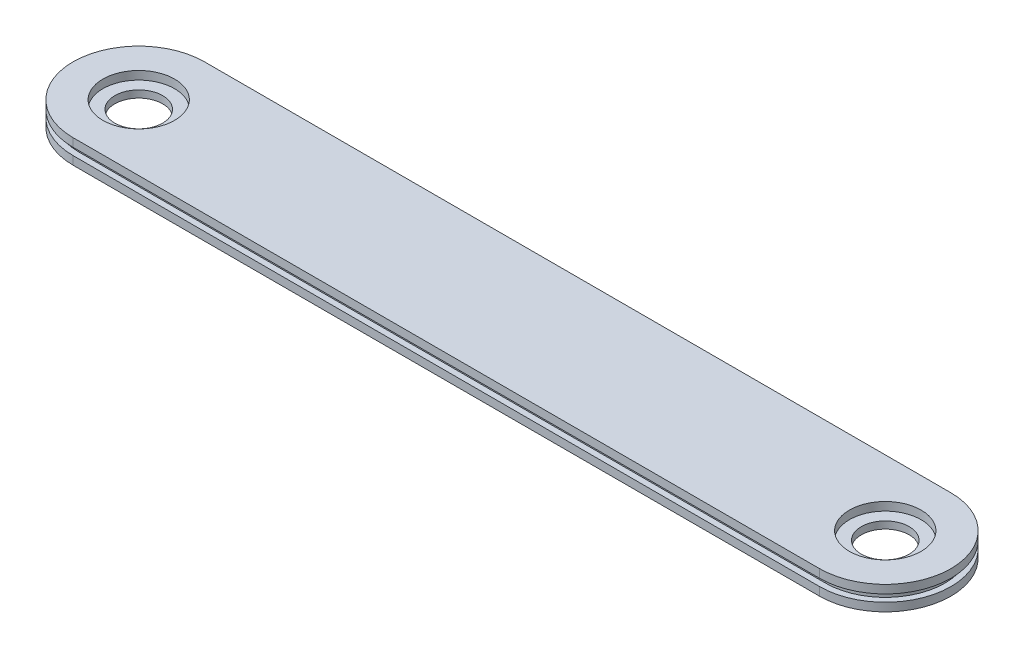
ISO-10303-21;
HEADER;
FILE_DESCRIPTION(('STEP AP214'),'2;1');
FILE_NAME('part.step','',(''),(''),'','','');
FILE_SCHEMA(('AUTOMOTIVE_DESIGN { 1 0 10303 214 1 1 1 1 }'));
ENDSEC;
DATA;
#1=APPLICATION_CONTEXT('core data for automotive mechanical design processes');
#2=APPLICATION_PROTOCOL_DEFINITION('international standard','automotive_design',2000,#1);
#3=PRODUCT_CONTEXT('',#1,'mechanical');
#4=PRODUCT('Part','Part','',(#3));
#5=PRODUCT_RELATED_PRODUCT_CATEGORY('part','',(#4));
#6=PRODUCT_DEFINITION_FORMATION('','',#4);
#7=PRODUCT_DEFINITION_CONTEXT('part definition',#1,'design');
#8=PRODUCT_DEFINITION('design','',#6,#7);
#9=PRODUCT_DEFINITION_SHAPE('','',#8);
#10=(LENGTH_UNIT() NAMED_UNIT(*) SI_UNIT(.MILLI.,.METRE.));
#11=(NAMED_UNIT(*) PLANE_ANGLE_UNIT() SI_UNIT($,.RADIAN.));
#12=(NAMED_UNIT(*) SI_UNIT($,.STERADIAN.) SOLID_ANGLE_UNIT());
#13=UNCERTAINTY_MEASURE_WITH_UNIT(LENGTH_MEASURE(1.E-05),#10,'distance_accuracy_value','');
#14=(GEOMETRIC_REPRESENTATION_CONTEXT(3) GLOBAL_UNCERTAINTY_ASSIGNED_CONTEXT((#13)) GLOBAL_UNIT_ASSIGNED_CONTEXT((#10,
#11,#12)) REPRESENTATION_CONTEXT('',''));
#15=CARTESIAN_POINT('',(0.,0.,0.));
#16=DIRECTION('',(0.,0.,1.));
#17=DIRECTION('',(1.,0.,0.));
#18=AXIS2_PLACEMENT_3D('',#15,#16,#17);
#19=CARTESIAN_POINT('',(0.,-3.,0.));
#20=DIRECTION('',(0.,1.,0.));
#21=DIRECTION('',(0.,0.,1.));
#22=AXIS2_PLACEMENT_3D('',#19,#20,#21);
#23=CYLINDRICAL_SURFACE('',#22,30.);
#24=CARTESIAN_POINT('',(0.,-10.,0.));
#25=DIRECTION('',(0.,1.,0.));
#26=DIRECTION('',(0.,0.,1.));
#27=AXIS2_PLACEMENT_3D('',#24,#25,#26);
#28=CIRCLE('',#27,30.);
#29=CARTESIAN_POINT('',(0.,-10.,30.));
#30=VERTEX_POINT('',#29);
#31=EDGE_CURVE('E451',#30,#30,#28,.T.);
#32=ORIENTED_EDGE('',*,*,#31,.F.);
#33=EDGE_LOOP('',(#32));
#34=FACE_BOUND('',#33,.T.);
#35=CARTESIAN_POINT('',(0.,-3.,0.));
#36=DIRECTION('',(0.,1.,0.));
#37=DIRECTION('',(0.,0.,1.));
#38=AXIS2_PLACEMENT_3D('',#35,#36,#37);
#39=CIRCLE('',#38,30.);
#40=CARTESIAN_POINT('',(0.,-3.,30.));
#41=VERTEX_POINT('',#40);
#42=EDGE_CURVE('E13',#41,#41,#39,.F.);
#43=ORIENTED_EDGE('',*,*,#42,.F.);
#44=EDGE_LOOP('',(#43));
#45=FACE_BOUND('',#44,.T.);
#46=ADVANCED_FACE('F193',(#34,#45),#23,.F.);
#47=CARTESIAN_POINT('',(625.,-3.,0.));
#48=DIRECTION('',(0.,1.,0.));
#49=DIRECTION('',(0.,0.,1.));
#50=AXIS2_PLACEMENT_3D('',#47,#48,#49);
#51=CYLINDRICAL_SURFACE('',#50,29.9999999999999);
#52=CARTESIAN_POINT('',(625.,-10.,0.));
#53=DIRECTION('',(0.,-1.,0.));
#54=DIRECTION('',(0.,0.,-1.));
#55=AXIS2_PLACEMENT_3D('',#52,#53,#54);
#56=CIRCLE('',#55,29.9999999999999);
#57=CARTESIAN_POINT('',(625.,-10.,-29.9999999999999));
#58=VERTEX_POINT('',#57);
#59=EDGE_CURVE('E383',#58,#58,#56,.T.);
#60=ORIENTED_EDGE('',*,*,#59,.T.);
#61=EDGE_LOOP('',(#60));
#62=FACE_BOUND('',#61,.T.);
#63=CARTESIAN_POINT('',(625.,-3.,0.));
#64=DIRECTION('',(0.,1.,0.));
#65=DIRECTION('',(0.,0.,1.));
#66=AXIS2_PLACEMENT_3D('',#63,#64,#65);
#67=CIRCLE('',#66,29.9999999999999);
#68=CARTESIAN_POINT('',(625.,-3.,29.9999999999999));
#69=VERTEX_POINT('',#68);
#70=EDGE_CURVE('E454',#69,#69,#67,.F.);
#71=ORIENTED_EDGE('',*,*,#70,.F.);
#72=EDGE_LOOP('',(#71));
#73=FACE_BOUND('',#72,.T.);
#74=ADVANCED_FACE('F378',(#62,#73),#51,.F.);
#75=CARTESIAN_POINT('',(0.,10.,0.));
#76=DIRECTION('',(0.,-1.,0.));
#77=DIRECTION('',(0.,0.,-1.));
#78=AXIS2_PLACEMENT_3D('',#75,#76,#77);
#79=CYLINDRICAL_SURFACE('',#78,55.);
#80=CARTESIAN_POINT('',(0.,-3.,0.));
#81=DIRECTION('',(0.,1.,0.));
#82=DIRECTION('',(0.,0.,1.));
#83=AXIS2_PLACEMENT_3D('',#80,#81,#82);
#84=CIRCLE('',#83,55.);
#85=CARTESIAN_POINT('',(0.,-3.,-55.));
#86=VERTEX_POINT('',#85);
#87=CARTESIAN_POINT('',(0.,-3.,55.));
#88=VERTEX_POINT('',#87);
#89=EDGE_CURVE('E324',#86,#88,#84,.T.);
#90=ORIENTED_EDGE('',*,*,#89,.F.);
#91=DIRECTION('',(0.,-1.,0.));
#92=VECTOR('',#91,1.);
#93=CARTESIAN_POINT('',(0.,10.,-55.));
#94=LINE('',#93,#92);
#95=CARTESIAN_POINT('',(0.,-10.,-55.));
#96=VERTEX_POINT('',#95);
#97=EDGE_CURVE('E338',#86,#96,#94,.T.);
#98=ORIENTED_EDGE('',*,*,#97,.T.);
#99=CARTESIAN_POINT('',(0.,-10.,0.));
#100=DIRECTION('',(0.,1.,0.));
#101=DIRECTION('',(0.,0.,1.));
#102=AXIS2_PLACEMENT_3D('',#99,#100,#101);
#103=CIRCLE('',#102,55.);
#104=CARTESIAN_POINT('',(0.,-10.,55.));
#105=VERTEX_POINT('',#104);
#106=EDGE_CURVE('E326',#96,#105,#103,.T.);
#107=ORIENTED_EDGE('',*,*,#106,.T.);
#108=DIRECTION('',(0.,-1.,0.));
#109=VECTOR('',#108,1.);
#110=CARTESIAN_POINT('',(0.,10.,55.));
#111=LINE('',#110,#109);
#112=EDGE_CURVE('E360',#88,#105,#111,.T.);
#113=ORIENTED_EDGE('',*,*,#112,.F.);
#114=EDGE_LOOP('',(#90,#98,#107,#113));
#115=FACE_BOUND('',#114,.T.);
#116=ADVANCED_FACE('F425',(#115),#79,.T.);
#117=CARTESIAN_POINT('',(0.,10.,55.));
#118=DIRECTION('',(0.,0.,-1.));
#119=DIRECTION('',(-1.,0.,0.));
#120=AXIS2_PLACEMENT_3D('',#117,#118,#119);
#121=PLANE('',#120);
#122=DIRECTION('',(1.,0.,0.));
#123=VECTOR('',#122,1.);
#124=CARTESIAN_POINT('',(0.,-3.,55.));
#125=LINE('',#124,#123);
#126=CARTESIAN_POINT('',(625.,-3.,55.));
#127=VERTEX_POINT('',#126);
#128=EDGE_CURVE('E322',#88,#127,#125,.T.);
#129=ORIENTED_EDGE('',*,*,#128,.F.);
#130=ORIENTED_EDGE('',*,*,#112,.T.);
#131=DIRECTION('',(1.,0.,0.));
#132=VECTOR('',#131,1.);
#133=CARTESIAN_POINT('',(0.,-10.,55.));
#134=LINE('',#133,#132);
#135=CARTESIAN_POINT('',(625.,-10.,55.));
#136=VERTEX_POINT('',#135);
#137=EDGE_CURVE('E341',#105,#136,#134,.T.);
#138=ORIENTED_EDGE('',*,*,#137,.T.);
#139=DIRECTION('',(0.,-1.,0.));
#140=VECTOR('',#139,1.);
#141=CARTESIAN_POINT('',(625.,10.,55.));
#142=LINE('',#141,#140);
#143=EDGE_CURVE('E356',#127,#136,#142,.T.);
#144=ORIENTED_EDGE('',*,*,#143,.F.);
#145=EDGE_LOOP('',(#129,#130,#138,#144));
#146=FACE_BOUND('',#145,.T.);
#147=ADVANCED_FACE('F502',(#146),#121,.F.);
#148=CARTESIAN_POINT('',(625.,10.,0.));
#149=DIRECTION('',(0.,-1.,0.));
#150=DIRECTION('',(0.,0.,-1.));
#151=AXIS2_PLACEMENT_3D('',#148,#149,#150);
#152=CYLINDRICAL_SURFACE('',#151,55.);
#153=CARTESIAN_POINT('',(625.,-3.,0.));
#154=DIRECTION('',(0.,1.,0.));
#155=DIRECTION('',(0.,0.,1.));
#156=AXIS2_PLACEMENT_3D('',#153,#154,#155);
#157=CIRCLE('',#156,55.);
#158=CARTESIAN_POINT('',(625.,-3.,-55.));
#159=VERTEX_POINT('',#158);
#160=EDGE_CURVE('E208',#127,#159,#157,.T.);
#161=ORIENTED_EDGE('',*,*,#160,.F.);
#162=ORIENTED_EDGE('',*,*,#143,.T.);
#163=CARTESIAN_POINT('',(625.,-10.,0.));
#164=DIRECTION('',(0.,1.,0.));
#165=DIRECTION('',(0.,0.,1.));
#166=AXIS2_PLACEMENT_3D('',#163,#164,#165);
#167=CIRCLE('',#166,55.);
#168=CARTESIAN_POINT('',(625.,-10.,-55.));
#169=VERTEX_POINT('',#168);
#170=EDGE_CURVE('E344',#136,#169,#167,.T.);
#171=ORIENTED_EDGE('',*,*,#170,.T.);
#172=DIRECTION('',(0.,-1.,0.));
#173=VECTOR('',#172,1.);
#174=CARTESIAN_POINT('',(625.,10.,-55.));
#175=LINE('',#174,#173);
#176=EDGE_CURVE('E352',#159,#169,#175,.T.);
#177=ORIENTED_EDGE('',*,*,#176,.F.);
#178=EDGE_LOOP('',(#161,#162,#171,#177));
#179=FACE_BOUND('',#178,.T.);
#180=ADVANCED_FACE('F499',(#179),#152,.T.);
#181=CARTESIAN_POINT('',(0.,10.,-55.));
#182=DIRECTION('',(0.,0.,-1.));
#183=DIRECTION('',(-1.,0.,0.));
#184=AXIS2_PLACEMENT_3D('',#181,#182,#183);
#185=PLANE('',#184);
#186=ORIENTED_EDGE('',*,*,#97,.F.);
#187=DIRECTION('',(1.,0.,0.));
#188=VECTOR('',#187,1.);
#189=CARTESIAN_POINT('',(0.,-3.,-55.));
#190=LINE('',#189,#188);
#191=EDGE_CURVE('E366',#86,#159,#190,.T.);
#192=ORIENTED_EDGE('',*,*,#191,.T.);
#193=ORIENTED_EDGE('',*,*,#176,.T.);
#194=DIRECTION('',(1.,0.,0.));
#195=VECTOR('',#194,1.);
#196=CARTESIAN_POINT('',(0.,-10.,-55.));
#197=LINE('',#196,#195);
#198=EDGE_CURVE('E331',#96,#169,#197,.T.);
#199=ORIENTED_EDGE('',*,*,#198,.F.);
#200=EDGE_LOOP('',(#186,#192,#193,#199));
#201=FACE_BOUND('',#200,.T.);
#202=ADVANCED_FACE('F491',(#201),#185,.T.);
#203=CARTESIAN_POINT('',(0.,-10.,0.));
#204=DIRECTION('',(0.,1.,0.));
#205=DIRECTION('',(0.,0.,1.));
#206=AXIS2_PLACEMENT_3D('',#203,#204,#205);
#207=PLANE('',#206);
#208=ORIENTED_EDGE('',*,*,#31,.T.);
#209=EDGE_LOOP('',(#208));
#210=FACE_BOUND('',#209,.T.);
#211=ORIENTED_EDGE('',*,*,#59,.F.);
#212=EDGE_LOOP('',(#211));
#213=FACE_BOUND('',#212,.T.);
#214=ORIENTED_EDGE('',*,*,#106,.F.);
#215=ORIENTED_EDGE('',*,*,#198,.T.);
#216=ORIENTED_EDGE('',*,*,#170,.F.);
#217=ORIENTED_EDGE('',*,*,#137,.F.);
#218=EDGE_LOOP('',(#214,#215,#216,#217));
#219=FACE_BOUND('',#218,.T.);
#220=ADVANCED_FACE('F477',(#210,#213,#219),#207,.F.);
#221=CARTESIAN_POINT('',(312.5,-3.,-32.1074938298136));
#222=DIRECTION('',(0.,1.,0.));
#223=DIRECTION('',(0.,0.,1.));
#224=AXIS2_PLACEMENT_3D('',#221,#222,#223);
#225=PLANE('',#224);
#226=DIRECTION('',(1.,0.,0.));
#227=VECTOR('',#226,1.);
#228=CARTESIAN_POINT('',(0.,-3.,-50.));
#229=LINE('',#228,#227);
#230=CARTESIAN_POINT('',(0.,-3.,-50.));
#231=VERTEX_POINT('',#230);
#232=CARTESIAN_POINT('',(625.,-3.,-50.));
#233=VERTEX_POINT('',#232);
#234=EDGE_CURVE('E290',#231,#233,#229,.T.);
#235=ORIENTED_EDGE('',*,*,#234,.T.);
#236=CARTESIAN_POINT('',(625.,-3.,0.));
#237=DIRECTION('',(0.,1.,0.));
#238=DIRECTION('',(0.,0.,1.));
#239=AXIS2_PLACEMENT_3D('',#236,#237,#238);
#240=CIRCLE('',#239,50.);
#241=CARTESIAN_POINT('',(625.,-3.,50.));
#242=VERTEX_POINT('',#241);
#243=EDGE_CURVE('E282',#242,#233,#240,.T.);
#244=ORIENTED_EDGE('',*,*,#243,.F.);
#245=DIRECTION('',(1.,0.,0.));
#246=VECTOR('',#245,1.);
#247=CARTESIAN_POINT('',(0.,-3.,50.));
#248=LINE('',#247,#246);
#249=CARTESIAN_POINT('',(0.,-3.,50.));
#250=VERTEX_POINT('',#249);
#251=EDGE_CURVE('E287',#250,#242,#248,.T.);
#252=ORIENTED_EDGE('',*,*,#251,.F.);
#253=CARTESIAN_POINT('',(0.,-3.,0.));
#254=DIRECTION('',(0.,1.,0.));
#255=DIRECTION('',(0.,0.,1.));
#256=AXIS2_PLACEMENT_3D('',#253,#254,#255);
#257=CIRCLE('',#256,50.);
#258=EDGE_CURVE('E307',#231,#250,#257,.T.);
#259=ORIENTED_EDGE('',*,*,#258,.F.);
#260=EDGE_LOOP('',(#235,#244,#252,#259));
#261=FACE_BOUND('',#260,.T.);
#262=ORIENTED_EDGE('',*,*,#89,.T.);
#263=ORIENTED_EDGE('',*,*,#128,.T.);
#264=ORIENTED_EDGE('',*,*,#160,.T.);
#265=ORIENTED_EDGE('',*,*,#191,.F.);
#266=EDGE_LOOP('',(#262,#263,#264,#265));
#267=FACE_BOUND('',#266,.T.);
#268=ADVANCED_FACE('F284',(#261,#267),#225,.T.);
#269=CARTESIAN_POINT('',(312.5,3.,-32.1074938298136));
#270=DIRECTION('',(0.,1.,0.));
#271=DIRECTION('',(0.,0.,1.));
#272=AXIS2_PLACEMENT_3D('',#269,#270,#271);
#273=PLANE('',#272);
#274=CARTESIAN_POINT('',(0.,3.,0.));
#275=DIRECTION('',(0.,1.,0.));
#276=DIRECTION('',(0.,0.,1.));
#277=AXIS2_PLACEMENT_3D('',#274,#275,#276);
#278=CIRCLE('',#277,50.);
#279=CARTESIAN_POINT('',(0.,3.,-50.));
#280=VERTEX_POINT('',#279);
#281=CARTESIAN_POINT('',(0.,3.,50.));
#282=VERTEX_POINT('',#281);
#283=EDGE_CURVE('E317',#280,#282,#278,.T.);
#284=ORIENTED_EDGE('',*,*,#283,.T.);
#285=DIRECTION('',(1.,0.,0.));
#286=VECTOR('',#285,1.);
#287=CARTESIAN_POINT('',(0.,3.,50.));
#288=LINE('',#287,#286);
#289=CARTESIAN_POINT('',(625.,3.,50.));
#290=VERTEX_POINT('',#289);
#291=EDGE_CURVE('E400',#282,#290,#288,.T.);
#292=ORIENTED_EDGE('',*,*,#291,.T.);
#293=CARTESIAN_POINT('',(625.,3.,0.));
#294=DIRECTION('',(0.,1.,0.));
#295=DIRECTION('',(0.,0.,1.));
#296=AXIS2_PLACEMENT_3D('',#293,#294,#295);
#297=CIRCLE('',#296,50.);
#298=CARTESIAN_POINT('',(625.,3.,-50.));
#299=VERTEX_POINT('',#298);
#300=EDGE_CURVE('E298',#290,#299,#297,.T.);
#301=ORIENTED_EDGE('',*,*,#300,.T.);
#302=DIRECTION('',(1.,0.,0.));
#303=VECTOR('',#302,1.);
#304=CARTESIAN_POINT('',(0.,3.,-50.));
#305=LINE('',#304,#303);
#306=EDGE_CURVE('E309',#280,#299,#305,.T.);
#307=ORIENTED_EDGE('',*,*,#306,.F.);
#308=EDGE_LOOP('',(#284,#292,#301,#307));
#309=FACE_BOUND('',#308,.T.);
#310=DIRECTION('',(1.,0.,0.));
#311=VECTOR('',#310,1.);
#312=CARTESIAN_POINT('',(0.,3.,-55.));
#313=LINE('',#312,#311);
#314=CARTESIAN_POINT('',(0.,3.,-55.));
#315=VERTEX_POINT('',#314);
#316=CARTESIAN_POINT('',(625.,3.,-55.));
#317=VERTEX_POINT('',#316);
#318=EDGE_CURVE('E364',#315,#317,#313,.T.);
#319=ORIENTED_EDGE('',*,*,#318,.T.);
#320=CARTESIAN_POINT('',(625.,3.,0.));
#321=DIRECTION('',(0.,1.,0.));
#322=DIRECTION('',(0.,0.,1.));
#323=AXIS2_PLACEMENT_3D('',#320,#321,#322);
#324=CIRCLE('',#323,55.);
#325=CARTESIAN_POINT('',(625.,3.,55.));
#326=VERTEX_POINT('',#325);
#327=EDGE_CURVE('E313',#326,#317,#324,.T.);
#328=ORIENTED_EDGE('',*,*,#327,.F.);
#329=DIRECTION('',(1.,0.,0.));
#330=VECTOR('',#329,1.);
#331=CARTESIAN_POINT('',(0.,3.,55.));
#332=LINE('',#331,#330);
#333=CARTESIAN_POINT('',(0.,3.,55.));
#334=VERTEX_POINT('',#333);
#335=EDGE_CURVE('E316',#334,#326,#332,.T.);
#336=ORIENTED_EDGE('',*,*,#335,.F.);
#337=CARTESIAN_POINT('',(0.,3.,0.));
#338=DIRECTION('',(0.,1.,0.));
#339=DIRECTION('',(0.,0.,1.));
#340=AXIS2_PLACEMENT_3D('',#337,#338,#339);
#341=CIRCLE('',#340,55.);
#342=EDGE_CURVE('E216',#315,#334,#341,.T.);
#343=ORIENTED_EDGE('',*,*,#342,.F.);
#344=EDGE_LOOP('',(#319,#328,#336,#343));
#345=FACE_BOUND('',#344,.T.);
#346=ADVANCED_FACE('F405',(#309,#345),#273,.F.);
#347=CARTESIAN_POINT('',(0.,-3.,0.));
#348=DIRECTION('',(0.,1.,0.));
#349=DIRECTION('',(0.,0.,1.));
#350=AXIS2_PLACEMENT_3D('',#347,#348,#349);
#351=CYLINDRICAL_SURFACE('',#350,50.);
#352=ORIENTED_EDGE('',*,*,#283,.F.);
#353=DIRECTION('',(0.,1.,0.));
#354=VECTOR('',#353,1.);
#355=CARTESIAN_POINT('',(0.,-3.,-50.));
#356=LINE('',#355,#354);
#357=EDGE_CURVE('E387',#231,#280,#356,.T.);
#358=ORIENTED_EDGE('',*,*,#357,.F.);
#359=ORIENTED_EDGE('',*,*,#258,.T.);
#360=DIRECTION('',(0.,1.,0.));
#361=VECTOR('',#360,1.);
#362=CARTESIAN_POINT('',(0.,-3.,50.));
#363=LINE('',#362,#361);
#364=EDGE_CURVE('E302',#250,#282,#363,.T.);
#365=ORIENTED_EDGE('',*,*,#364,.T.);
#366=EDGE_LOOP('',(#352,#358,#359,#365));
#367=FACE_BOUND('',#366,.T.);
#368=ADVANCED_FACE('F407',(#367),#351,.T.);
#369=CARTESIAN_POINT('',(0.,-3.,-50.));
#370=DIRECTION('',(0.,0.,1.));
#371=DIRECTION('',(1.,0.,0.));
#372=AXIS2_PLACEMENT_3D('',#369,#370,#371);
#373=PLANE('',#372);
#374=ORIENTED_EDGE('',*,*,#306,.T.);
#375=DIRECTION('',(0.,1.,0.));
#376=VECTOR('',#375,1.);
#377=CARTESIAN_POINT('',(625.,-3.,-50.));
#378=LINE('',#377,#376);
#379=EDGE_CURVE('E303',#233,#299,#378,.T.);
#380=ORIENTED_EDGE('',*,*,#379,.F.);
#381=ORIENTED_EDGE('',*,*,#234,.F.);
#382=ORIENTED_EDGE('',*,*,#357,.T.);
#383=EDGE_LOOP('',(#374,#380,#381,#382));
#384=FACE_BOUND('',#383,.T.);
#385=ADVANCED_FACE('F409',(#384),#373,.F.);
#386=CARTESIAN_POINT('',(625.,-3.,0.));
#387=DIRECTION('',(0.,1.,0.));
#388=DIRECTION('',(0.,0.,1.));
#389=AXIS2_PLACEMENT_3D('',#386,#387,#388);
#390=CYLINDRICAL_SURFACE('',#389,50.);
#391=ORIENTED_EDGE('',*,*,#300,.F.);
#392=DIRECTION('',(0.,1.,0.));
#393=VECTOR('',#392,1.);
#394=CARTESIAN_POINT('',(625.,-3.,50.));
#395=LINE('',#394,#393);
#396=EDGE_CURVE('E295',#242,#290,#395,.T.);
#397=ORIENTED_EDGE('',*,*,#396,.F.);
#398=ORIENTED_EDGE('',*,*,#243,.T.);
#399=ORIENTED_EDGE('',*,*,#379,.T.);
#400=EDGE_LOOP('',(#391,#397,#398,#399));
#401=FACE_BOUND('',#400,.T.);
#402=ADVANCED_FACE('F296',(#401),#390,.T.);
#403=CARTESIAN_POINT('',(0.,-3.,50.));
#404=DIRECTION('',(0.,0.,1.));
#405=DIRECTION('',(1.,0.,0.));
#406=AXIS2_PLACEMENT_3D('',#403,#404,#405);
#407=PLANE('',#406);
#408=ORIENTED_EDGE('',*,*,#291,.F.);
#409=ORIENTED_EDGE('',*,*,#364,.F.);
#410=ORIENTED_EDGE('',*,*,#251,.T.);
#411=ORIENTED_EDGE('',*,*,#396,.T.);
#412=EDGE_LOOP('',(#408,#409,#410,#411));
#413=FACE_BOUND('',#412,.T.);
#414=ADVANCED_FACE('F305',(#413),#407,.T.);
#415=CARTESIAN_POINT('',(0.,10.,0.));
#416=DIRECTION('',(0.,1.,0.));
#417=DIRECTION('',(0.,0.,1.));
#418=AXIS2_PLACEMENT_3D('',#415,#416,#417);
#419=PLANE('',#418);
#420=CARTESIAN_POINT('',(0.,10.,0.));
#421=DIRECTION('',(0.,1.,0.));
#422=DIRECTION('',(0.,0.,1.));
#423=AXIS2_PLACEMENT_3D('',#420,#421,#422);
#424=CIRCLE('',#423,30.);
#425=CARTESIAN_POINT('',(0.,10.,30.));
#426=VERTEX_POINT('',#425);
#427=EDGE_CURVE('E449',#426,#426,#424,.T.);
#428=ORIENTED_EDGE('',*,*,#427,.F.);
#429=EDGE_LOOP('',(#428));
#430=FACE_BOUND('',#429,.T.);
#431=CARTESIAN_POINT('',(625.,10.,0.));
#432=DIRECTION('',(0.,-1.,0.));
#433=DIRECTION('',(0.,0.,-1.));
#434=AXIS2_PLACEMENT_3D('',#431,#432,#433);
#435=CIRCLE('',#434,29.9999999999999);
#436=CARTESIAN_POINT('',(625.,10.,-29.9999999999999));
#437=VERTEX_POINT('',#436);
#438=EDGE_CURVE('E381',#437,#437,#435,.T.);
#439=ORIENTED_EDGE('',*,*,#438,.T.);
#440=EDGE_LOOP('',(#439));
#441=FACE_BOUND('',#440,.T.);
#442=CARTESIAN_POINT('',(0.,10.,0.));
#443=DIRECTION('',(0.,1.,0.));
#444=DIRECTION('',(0.,0.,1.));
#445=AXIS2_PLACEMENT_3D('',#442,#443,#444);
#446=CIRCLE('',#445,55.);
#447=CARTESIAN_POINT('',(0.,10.,-55.));
#448=VERTEX_POINT('',#447);
#449=CARTESIAN_POINT('',(0.,10.,55.));
#450=VERTEX_POINT('',#449);
#451=EDGE_CURVE('E327',#448,#450,#446,.T.);
#452=ORIENTED_EDGE('',*,*,#451,.T.);
#453=DIRECTION('',(1.,0.,0.));
#454=VECTOR('',#453,1.);
#455=CARTESIAN_POINT('',(0.,10.,55.));
#456=LINE('',#455,#454);
#457=CARTESIAN_POINT('',(625.,10.,55.));
#458=VERTEX_POINT('',#457);
#459=EDGE_CURVE('E330',#450,#458,#456,.T.);
#460=ORIENTED_EDGE('',*,*,#459,.T.);
#461=CARTESIAN_POINT('',(625.,10.,0.));
#462=DIRECTION('',(0.,1.,0.));
#463=DIRECTION('',(0.,0.,1.));
#464=AXIS2_PLACEMENT_3D('',#461,#462,#463);
#465=CIRCLE('',#464,55.);
#466=CARTESIAN_POINT('',(625.,10.,-55.));
#467=VERTEX_POINT('',#466);
#468=EDGE_CURVE('E333',#458,#467,#465,.T.);
#469=ORIENTED_EDGE('',*,*,#468,.T.);
#470=DIRECTION('',(1.,0.,0.));
#471=VECTOR('',#470,1.);
#472=CARTESIAN_POINT('',(0.,10.,-55.));
#473=LINE('',#472,#471);
#474=EDGE_CURVE('E335',#448,#467,#473,.T.);
#475=ORIENTED_EDGE('',*,*,#474,.F.);
#476=EDGE_LOOP('',(#452,#460,#469,#475));
#477=FACE_BOUND('',#476,.T.);
#478=ADVANCED_FACE('F480',(#430,#441,#477),#419,.T.);
#479=ORIENTED_EDGE('',*,*,#318,.F.);
#480=EDGE_CURVE('E349',#448,#315,#94,.T.);
#481=ORIENTED_EDGE('',*,*,#480,.F.);
#482=ORIENTED_EDGE('',*,*,#474,.T.);
#483=EDGE_CURVE('E353',#467,#317,#175,.T.);
#484=ORIENTED_EDGE('',*,*,#483,.T.);
#485=EDGE_LOOP('',(#479,#481,#482,#484));
#486=FACE_BOUND('',#485,.T.);
#487=ADVANCED_FACE('F484',(#486),#185,.T.);
#488=EDGE_CURVE('E357',#458,#326,#142,.T.);
#489=ORIENTED_EDGE('',*,*,#488,.T.);
#490=ORIENTED_EDGE('',*,*,#327,.T.);
#491=ORIENTED_EDGE('',*,*,#483,.F.);
#492=ORIENTED_EDGE('',*,*,#468,.F.);
#493=EDGE_LOOP('',(#489,#490,#491,#492));
#494=FACE_BOUND('',#493,.T.);
#495=ADVANCED_FACE('F488',(#494),#152,.T.);
#496=EDGE_CURVE('E361',#450,#334,#111,.T.);
#497=ORIENTED_EDGE('',*,*,#496,.T.);
#498=ORIENTED_EDGE('',*,*,#335,.T.);
#499=ORIENTED_EDGE('',*,*,#488,.F.);
#500=ORIENTED_EDGE('',*,*,#459,.F.);
#501=EDGE_LOOP('',(#497,#498,#499,#500));
#502=FACE_BOUND('',#501,.T.);
#503=ADVANCED_FACE('F497',(#502),#121,.F.);
#504=ORIENTED_EDGE('',*,*,#480,.T.);
#505=ORIENTED_EDGE('',*,*,#342,.T.);
#506=ORIENTED_EDGE('',*,*,#496,.F.);
#507=ORIENTED_EDGE('',*,*,#451,.F.);
#508=EDGE_LOOP('',(#504,#505,#506,#507));
#509=FACE_BOUND('',#508,.T.);
#510=ADVANCED_FACE('F195',(#509),#79,.T.);
#511=CARTESIAN_POINT('',(625.,3.,0.));
#512=DIRECTION('',(0.,1.,0.));
#513=DIRECTION('',(0.,0.,1.));
#514=AXIS2_PLACEMENT_3D('',#511,#512,#513);
#515=CIRCLE('',#514,29.9999999999999);
#516=CARTESIAN_POINT('',(625.,3.,29.9999999999999));
#517=VERTEX_POINT('',#516);
#518=EDGE_CURVE('E201',#517,#517,#515,.T.);
#519=ORIENTED_EDGE('',*,*,#518,.F.);
#520=EDGE_LOOP('',(#519));
#521=FACE_BOUND('',#520,.T.);
#522=ORIENTED_EDGE('',*,*,#438,.F.);
#523=EDGE_LOOP('',(#522));
#524=FACE_BOUND('',#523,.T.);
#525=ADVANCED_FACE('F373',(#521,#524),#51,.F.);
#526=CARTESIAN_POINT('',(625.,3.,0.));
#527=DIRECTION('',(0.,-1.,0.));
#528=DIRECTION('',(0.,0.,-1.));
#529=AXIS2_PLACEMENT_3D('',#526,#527,#528);
#530=CYLINDRICAL_SURFACE('',#529,20.0000000000001);
#531=CARTESIAN_POINT('',(625.,3.,0.));
#532=DIRECTION('',(0.,1.,0.));
#533=DIRECTION('',(0.,0.,1.));
#534=AXIS2_PLACEMENT_3D('',#531,#532,#533);
#535=CIRCLE('',#534,20.0000000000001);
#536=CARTESIAN_POINT('',(625.,3.,20.0000000000001));
#537=VERTEX_POINT('',#536);
#538=EDGE_CURVE('E384',#537,#537,#535,.F.);
#539=ORIENTED_EDGE('',*,*,#538,.F.);
#540=EDGE_LOOP('',(#539));
#541=FACE_BOUND('',#540,.T.);
#542=CARTESIAN_POINT('',(625.,-3.,0.));
#543=DIRECTION('',(0.,1.,0.));
#544=DIRECTION('',(0.,0.,1.));
#545=AXIS2_PLACEMENT_3D('',#542,#543,#544);
#546=CIRCLE('',#545,20.0000000000001);
#547=CARTESIAN_POINT('',(625.,-3.,20.0000000000001));
#548=VERTEX_POINT('',#547);
#549=EDGE_CURVE('E390',#548,#548,#546,.F.);
#550=ORIENTED_EDGE('',*,*,#549,.T.);
#551=EDGE_LOOP('',(#550));
#552=FACE_BOUND('',#551,.T.);
#553=ADVANCED_FACE('F376',(#541,#552),#530,.F.);
#554=CARTESIAN_POINT('',(0.,3.,0.));
#555=DIRECTION('',(0.,1.,0.));
#556=DIRECTION('',(0.,0.,1.));
#557=AXIS2_PLACEMENT_3D('',#554,#555,#556);
#558=PLANE('',#557);
#559=ORIENTED_EDGE('',*,*,#518,.T.);
#560=EDGE_LOOP('',(#559));
#561=FACE_BOUND('',#560,.T.);
#562=ORIENTED_EDGE('',*,*,#538,.T.);
#563=EDGE_LOOP('',(#562));
#564=FACE_BOUND('',#563,.T.);
#565=ADVANCED_FACE('F370',(#561,#564),#558,.T.);
#566=CARTESIAN_POINT('',(0.,-3.,0.));
#567=DIRECTION('',(0.,1.,0.));
#568=DIRECTION('',(0.,0.,1.));
#569=AXIS2_PLACEMENT_3D('',#566,#567,#568);
#570=PLANE('',#569);
#571=ORIENTED_EDGE('',*,*,#70,.T.);
#572=EDGE_LOOP('',(#571));
#573=FACE_BOUND('',#572,.T.);
#574=ORIENTED_EDGE('',*,*,#549,.F.);
#575=EDGE_LOOP('',(#574));
#576=FACE_BOUND('',#575,.T.);
#577=ADVANCED_FACE('F432',(#573,#576),#570,.F.);
#578=CARTESIAN_POINT('',(0.,3.,0.));
#579=DIRECTION('',(0.,1.,0.));
#580=DIRECTION('',(0.,0.,1.));
#581=AXIS2_PLACEMENT_3D('',#578,#579,#580);
#582=CIRCLE('',#581,30.);
#583=CARTESIAN_POINT('',(0.,3.,30.));
#584=VERTEX_POINT('',#583);
#585=EDGE_CURVE('E446',#584,#584,#582,.T.);
#586=ORIENTED_EDGE('',*,*,#585,.F.);
#587=EDGE_LOOP('',(#586));
#588=FACE_BOUND('',#587,.T.);
#589=ORIENTED_EDGE('',*,*,#427,.T.);
#590=EDGE_LOOP('',(#589));
#591=FACE_BOUND('',#590,.T.);
#592=ADVANCED_FACE('F421',(#588,#591),#23,.F.);
#593=CARTESIAN_POINT('',(0.,3.,0.));
#594=DIRECTION('',(0.,-1.,0.));
#595=DIRECTION('',(0.,0.,-1.));
#596=AXIS2_PLACEMENT_3D('',#593,#594,#595);
#597=CYLINDRICAL_SURFACE('',#596,20.);
#598=CARTESIAN_POINT('',(0.,3.,0.));
#599=DIRECTION('',(0.,1.,0.));
#600=DIRECTION('',(0.,0.,1.));
#601=AXIS2_PLACEMENT_3D('',#598,#599,#600);
#602=CIRCLE('',#601,20.);
#603=CARTESIAN_POINT('',(0.,3.,20.));
#604=VERTEX_POINT('',#603);
#605=EDGE_CURVE('E456',#604,#604,#602,.T.);
#606=ORIENTED_EDGE('',*,*,#605,.T.);
#607=EDGE_LOOP('',(#606));
#608=FACE_BOUND('',#607,.T.);
#609=CARTESIAN_POINT('',(0.,-3.,0.));
#610=DIRECTION('',(0.,1.,0.));
#611=DIRECTION('',(0.,0.,1.));
#612=AXIS2_PLACEMENT_3D('',#609,#610,#611);
#613=CIRCLE('',#612,20.);
#614=CARTESIAN_POINT('',(0.,-3.,20.));
#615=VERTEX_POINT('',#614);
#616=EDGE_CURVE('E681',#615,#615,#613,.T.);
#617=ORIENTED_EDGE('',*,*,#616,.F.);
#618=EDGE_LOOP('',(#617));
#619=FACE_BOUND('',#618,.T.);
#620=ADVANCED_FACE('F431',(#608,#619),#597,.F.);
#621=CARTESIAN_POINT('',(0.,3.,0.));
#622=DIRECTION('',(0.,1.,0.));
#623=DIRECTION('',(0.,0.,1.));
#624=AXIS2_PLACEMENT_3D('',#621,#622,#623);
#625=PLANE('',#624);
#626=ORIENTED_EDGE('',*,*,#605,.F.);
#627=EDGE_LOOP('',(#626));
#628=FACE_BOUND('',#627,.T.);
#629=ORIENTED_EDGE('',*,*,#585,.T.);
#630=EDGE_LOOP('',(#629));
#631=FACE_BOUND('',#630,.T.);
#632=ADVANCED_FACE('F438',(#628,#631),#625,.T.);
#633=CARTESIAN_POINT('',(0.,-3.,0.));
#634=DIRECTION('',(0.,1.,0.));
#635=DIRECTION('',(0.,0.,1.));
#636=AXIS2_PLACEMENT_3D('',#633,#634,#635);
#637=PLANE('',#636);
#638=ORIENTED_EDGE('',*,*,#616,.T.);
#639=EDGE_LOOP('',(#638));
#640=FACE_BOUND('',#639,.T.);
#641=ORIENTED_EDGE('',*,*,#42,.T.);
#642=EDGE_LOOP('',(#641));
#643=FACE_BOUND('',#642,.T.);
#644=ADVANCED_FACE('F661',(#640,#643),#637,.F.);
#645=CLOSED_SHELL('',(#46,#74,#116,#147,#180,#202,#220,#268,#346,#368,#385,#402,#414,#478,#487,
#495,#503,#510,#525,#553,#565,#577,#592,#620,#632,#644));
#646=MANIFOLD_SOLID_BREP('B2',#645);
#647=ADVANCED_BREP_SHAPE_REPRESENTATION('',(#18,#646),#14);
#648=SHAPE_DEFINITION_REPRESENTATION(#9,#647);
ENDSEC;
END-ISO-10303-21;
